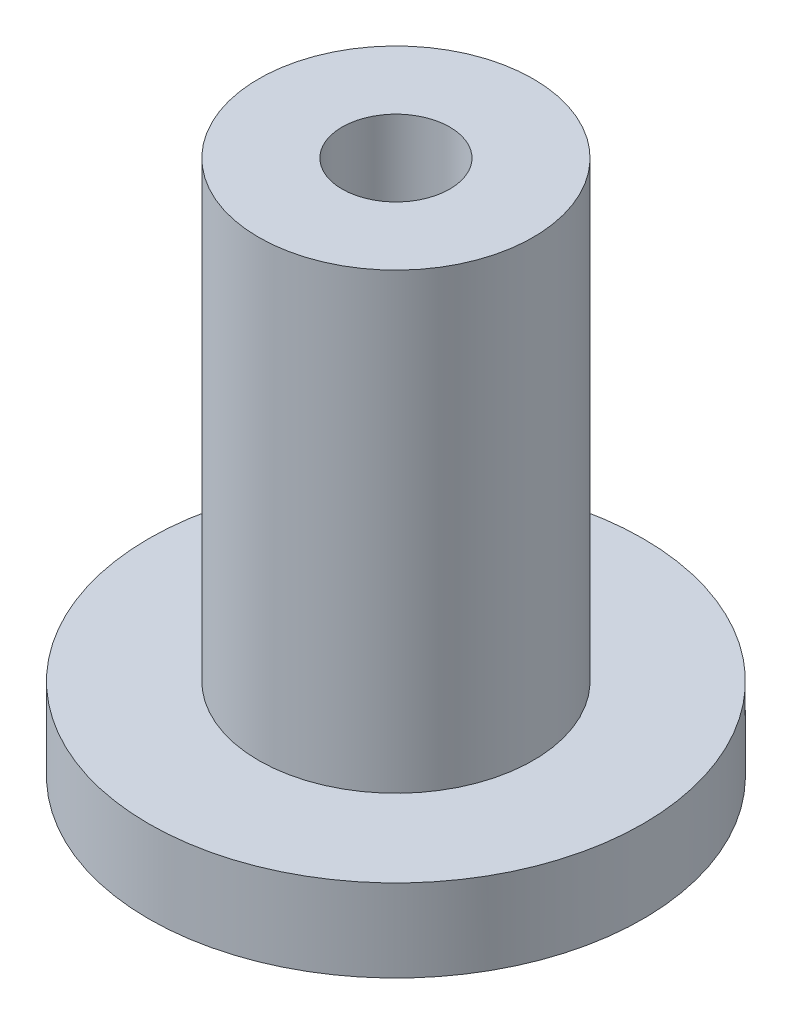
ISO-10303-21;
HEADER;
FILE_DESCRIPTION(('STEP AP214'),'2;1');
FILE_NAME('part.step','',(''),(''),'','','');
FILE_SCHEMA(('AUTOMOTIVE_DESIGN { 1 0 10303 214 1 1 1 1 }'));
ENDSEC;
DATA;
#1=APPLICATION_CONTEXT('core data for automotive mechanical design processes');
#2=APPLICATION_PROTOCOL_DEFINITION('international standard','automotive_design',2000,#1);
#3=PRODUCT_CONTEXT('',#1,'mechanical');
#4=PRODUCT('Part','Part','',(#3));
#5=PRODUCT_RELATED_PRODUCT_CATEGORY('part','',(#4));
#6=PRODUCT_DEFINITION_FORMATION('','',#4);
#7=PRODUCT_DEFINITION_CONTEXT('part definition',#1,'design');
#8=PRODUCT_DEFINITION('design','',#6,#7);
#9=PRODUCT_DEFINITION_SHAPE('','',#8);
#10=(LENGTH_UNIT() NAMED_UNIT(*) SI_UNIT(.MILLI.,.METRE.));
#11=(NAMED_UNIT(*) PLANE_ANGLE_UNIT() SI_UNIT($,.RADIAN.));
#12=(NAMED_UNIT(*) SI_UNIT($,.STERADIAN.) SOLID_ANGLE_UNIT());
#13=UNCERTAINTY_MEASURE_WITH_UNIT(LENGTH_MEASURE(1.E-05),#10,'distance_accuracy_value','');
#14=(GEOMETRIC_REPRESENTATION_CONTEXT(3) GLOBAL_UNCERTAINTY_ASSIGNED_CONTEXT((#13)) GLOBAL_UNIT_ASSIGNED_CONTEXT((#10,
#11,#12)) REPRESENTATION_CONTEXT('',''));
#15=CARTESIAN_POINT('',(0.,0.,0.));
#16=DIRECTION('',(0.,0.,1.));
#17=DIRECTION('',(1.,0.,0.));
#18=AXIS2_PLACEMENT_3D('',#15,#16,#17);
#19=CARTESIAN_POINT('',(0.,26.19375,0.));
#20=DIRECTION('',(0.,-1.,0.));
#21=DIRECTION('',(0.,0.,-1.));
#22=AXIS2_PLACEMENT_3D('',#19,#20,#21);
#23=CYLINDRICAL_SURFACE('',#22,3.1115);
#24=CARTESIAN_POINT('',(0.,26.19375,0.));
#25=DIRECTION('',(0.,1.,0.));
#26=DIRECTION('',(0.,0.,1.));
#27=AXIS2_PLACEMENT_3D('',#24,#25,#26);
#28=CIRCLE('',#27,3.1115);
#29=CARTESIAN_POINT('',(0.,26.19375,3.1115));
#30=VERTEX_POINT('',#29);
#31=EDGE_CURVE('E48',#30,#30,#28,.T.);
#32=ORIENTED_EDGE('',*,*,#31,.T.);
#33=EDGE_LOOP('',(#32));
#34=FACE_BOUND('',#33,.T.);
#35=CARTESIAN_POINT('',(0.,0.126999999999999,0.));
#36=DIRECTION('',(0.,-1.,0.));
#37=DIRECTION('',(0.,0.,-1.));
#38=AXIS2_PLACEMENT_3D('',#35,#36,#37);
#39=CIRCLE('',#38,3.1115);
#40=CARTESIAN_POINT('',(0.,0.126999999999999,-3.1115));
#41=VERTEX_POINT('',#40);
#42=EDGE_CURVE('E34',#41,#41,#39,.T.);
#43=ORIENTED_EDGE('',*,*,#42,.T.);
#44=EDGE_LOOP('',(#43));
#45=FACE_BOUND('',#44,.T.);
#46=ADVANCED_FACE('F30',(#34,#45),#23,.F.);
#47=CARTESIAN_POINT('',(0.,26.19375,0.));
#48=DIRECTION('',(0.,1.,0.));
#49=DIRECTION('',(0.,0.,1.));
#50=AXIS2_PLACEMENT_3D('',#47,#48,#49);
#51=PLANE('',#50);
#52=CARTESIAN_POINT('',(0.,26.19375,0.));
#53=DIRECTION('',(0.,1.,0.));
#54=DIRECTION('',(0.,0.,1.));
#55=AXIS2_PLACEMENT_3D('',#52,#53,#54);
#56=CIRCLE('',#55,7.9375);
#57=CARTESIAN_POINT('',(0.,26.19375,7.9375));
#58=VERTEX_POINT('',#57);
#59=EDGE_CURVE('E42',#58,#58,#56,.T.);
#60=ORIENTED_EDGE('',*,*,#59,.T.);
#61=EDGE_LOOP('',(#60));
#62=FACE_BOUND('',#61,.T.);
#63=ORIENTED_EDGE('',*,*,#31,.F.);
#64=EDGE_LOOP('',(#63));
#65=FACE_BOUND('',#64,.T.);
#66=ADVANCED_FACE('F77',(#62,#65),#51,.T.);
#67=CARTESIAN_POINT('',(0.,26.19375,0.));
#68=DIRECTION('',(0.,-1.,0.));
#69=DIRECTION('',(0.,0.,-1.));
#70=AXIS2_PLACEMENT_3D('',#67,#68,#69);
#71=CYLINDRICAL_SURFACE('',#70,7.9375);
#72=ORIENTED_EDGE('',*,*,#59,.F.);
#73=EDGE_LOOP('',(#72));
#74=FACE_BOUND('',#73,.T.);
#75=CARTESIAN_POINT('',(0.,0.,0.));
#76=DIRECTION('',(0.,1.,0.));
#77=DIRECTION('',(0.,0.,1.));
#78=AXIS2_PLACEMENT_3D('',#75,#76,#77);
#79=CIRCLE('',#78,7.9375);
#80=CARTESIAN_POINT('',(0.,0.,7.9375));
#81=VERTEX_POINT('',#80);
#82=EDGE_CURVE('E45',#81,#81,#79,.T.);
#83=ORIENTED_EDGE('',*,*,#82,.T.);
#84=EDGE_LOOP('',(#83));
#85=FACE_BOUND('',#84,.T.);
#86=ADVANCED_FACE('F83',(#74,#85),#71,.T.);
#87=CARTESIAN_POINT('',(0.,-6.35,0.));
#88=DIRECTION('',(0.,1.,0.));
#89=DIRECTION('',(0.,0.,1.));
#90=AXIS2_PLACEMENT_3D('',#87,#88,#89);
#91=CYLINDRICAL_SURFACE('',#90,14.2875);
#92=CARTESIAN_POINT('',(0.,-4.76249999999999,0.));
#93=DIRECTION('',(0.,-1.,0.));
#94=DIRECTION('',(0.,0.,-1.));
#95=AXIS2_PLACEMENT_3D('',#92,#93,#94);
#96=CIRCLE('',#95,14.2875);
#97=CARTESIAN_POINT('',(0.,-4.76249999999999,14.2875));
#98=VERTEX_POINT('',#97);
#99=EDGE_CURVE('E10',#98,#98,#96,.F.);
#100=ORIENTED_EDGE('',*,*,#99,.T.);
#101=EDGE_LOOP('',(#100));
#102=FACE_BOUND('',#101,.T.);
#103=CARTESIAN_POINT('',(0.,0.,0.));
#104=DIRECTION('',(0.,-1.,0.));
#105=DIRECTION('',(0.,0.,-1.));
#106=AXIS2_PLACEMENT_3D('',#103,#104,#105);
#107=CIRCLE('',#106,14.2875);
#108=CARTESIAN_POINT('',(0.,0.,-14.2875));
#109=VERTEX_POINT('',#108);
#110=EDGE_CURVE('E49',#109,#109,#107,.T.);
#111=ORIENTED_EDGE('',*,*,#110,.T.);
#112=EDGE_LOOP('',(#111));
#113=FACE_BOUND('',#112,.T.);
#114=ADVANCED_FACE('F87',(#102,#113),#91,.T.);
#115=CARTESIAN_POINT('',(0.,-6.35,0.));
#116=DIRECTION('',(0.,-1.,0.));
#117=DIRECTION('',(0.,0.,-1.));
#118=AXIS2_PLACEMENT_3D('',#115,#116,#117);
#119=PLANE('',#118);
#120=CARTESIAN_POINT('',(0.,-6.35,0.));
#121=DIRECTION('',(0.,-1.,0.));
#122=DIRECTION('',(0.,0.,-1.));
#123=AXIS2_PLACEMENT_3D('',#120,#121,#122);
#124=CIRCLE('',#123,4.6736);
#125=CARTESIAN_POINT('',(0.,-6.35,-4.6736));
#126=VERTEX_POINT('',#125);
#127=EDGE_CURVE('E56',#126,#126,#124,.T.);
#128=ORIENTED_EDGE('',*,*,#127,.F.);
#129=EDGE_LOOP('',(#128));
#130=FACE_BOUND('',#129,.T.);
#131=CARTESIAN_POINT('',(0.,-6.35,0.));
#132=DIRECTION('',(0.,-1.,0.));
#133=DIRECTION('',(0.,0.,-1.));
#134=AXIS2_PLACEMENT_3D('',#131,#132,#133);
#135=CIRCLE('',#134,9.92587959661578);
#136=CARTESIAN_POINT('',(0.,-6.35,9.92587959661578));
#137=VERTEX_POINT('',#136);
#138=EDGE_CURVE('E38',#137,#137,#135,.T.);
#139=ORIENTED_EDGE('',*,*,#138,.T.);
#140=EDGE_LOOP('',(#139));
#141=FACE_BOUND('',#140,.T.);
#142=ADVANCED_FACE('F94',(#130,#141),#119,.T.);
#143=CARTESIAN_POINT('',(0.,0.,0.));
#144=DIRECTION('',(0.,-1.,0.));
#145=DIRECTION('',(0.,0.,-1.));
#146=AXIS2_PLACEMENT_3D('',#143,#144,#145);
#147=PLANE('',#146);
#148=ORIENTED_EDGE('',*,*,#82,.F.);
#149=EDGE_LOOP('',(#148));
#150=FACE_BOUND('',#149,.T.);
#151=ORIENTED_EDGE('',*,*,#110,.F.);
#152=EDGE_LOOP('',(#151));
#153=FACE_BOUND('',#152,.T.);
#154=ADVANCED_FACE('F99',(#150,#153),#147,.F.);
#155=CARTESIAN_POINT('',(0.,-6.35,0.));
#156=DIRECTION('',(0.,1.,0.));
#157=DIRECTION('',(0.,0.,1.));
#158=AXIS2_PLACEMENT_3D('',#155,#156,#157);
#159=CONICAL_SURFACE('',#158,9.92587959661578,1.22173047639603);
#160=CARTESIAN_POINT('',(0.,-4.76249999999999,14.2875));
#161=CARTESIAN_POINT('',(0.,-4.77903645833332,14.2420664541314));
#162=CARTESIAN_POINT('',(0.,-4.79557291666666,14.1966329082628));
#163=CARTESIAN_POINT('',(0.,-4.82864583333332,14.1057658165257));
#164=CARTESIAN_POINT('',(0.,-4.84518229166666,14.0603322706571));
#165=CARTESIAN_POINT('',(0.,-4.87825520833333,13.9694651789199));
#166=CARTESIAN_POINT('',(0.,-4.89479166666666,13.9240316330513));
#167=CARTESIAN_POINT('',(0.,-4.92786458333333,13.8331645413141));
#168=CARTESIAN_POINT('',(0.,-4.94440104166666,13.7877309954456));
#169=CARTESIAN_POINT('',(0.,-4.97747395833333,13.6968639037084));
#170=CARTESIAN_POINT('',(0.,-4.99401041666666,13.6514303578398));
#171=CARTESIAN_POINT('',(0.,-5.02708333333333,13.5605632661026));
#172=CARTESIAN_POINT('',(0.,-5.04361979166666,13.515129720234));
#173=CARTESIAN_POINT('',(0.,-5.07669270833333,13.4242626284969));
#174=CARTESIAN_POINT('',(0.,-5.09322916666666,13.3788290826283));
#175=CARTESIAN_POINT('',(0.,-5.12630208333333,13.2879619908911));
#176=CARTESIAN_POINT('',(0.,-5.14283854166666,13.2425284450225));
#177=CARTESIAN_POINT('',(0.,-5.17591145833333,13.1516613532854));
#178=CARTESIAN_POINT('',(0.,-5.19244791666666,13.1062278074168));
#179=CARTESIAN_POINT('',(0.,-5.22552083333333,13.0153607156796));
#180=CARTESIAN_POINT('',(0.,-5.24205729166666,12.969927169811));
#181=CARTESIAN_POINT('',(0.,-5.27513020833333,12.8790600780738));
#182=CARTESIAN_POINT('',(0.,-5.29166666666666,12.8336265322053));
#183=CARTESIAN_POINT('',(0.,-5.32473958333333,12.7427594404681));
#184=CARTESIAN_POINT('',(0.,-5.34127604166666,12.6973258945995));
#185=CARTESIAN_POINT('',(0.,-5.37434895833333,12.6064588028623));
#186=CARTESIAN_POINT('',(0.,-5.39088541666666,12.5610252569937));
#187=CARTESIAN_POINT('',(0.,-5.42395833333333,12.4701581652566));
#188=CARTESIAN_POINT('',(0.,-5.44049479166666,12.424724619388));
#189=CARTESIAN_POINT('',(0.,-5.47356770833333,12.3338575276508));
#190=CARTESIAN_POINT('',(0.,-5.49010416666666,12.2884239817822));
#191=CARTESIAN_POINT('',(0.,-5.52317708333333,12.1975568900451));
#192=CARTESIAN_POINT('',(0.,-5.53971354166666,12.1521233441765));
#193=CARTESIAN_POINT('',(0.,-5.57278645833333,12.0612562524393));
#194=CARTESIAN_POINT('',(0.,-5.58932291666666,12.0158227065707));
#195=CARTESIAN_POINT('',(0.,-5.62239583333333,11.9249556148335));
#196=CARTESIAN_POINT('',(0.,-5.63893229166666,11.879522068965));
#197=CARTESIAN_POINT('',(0.,-5.67200520833333,11.7886549772278));
#198=CARTESIAN_POINT('',(0.,-5.68854166666666,11.7432214313592));
#199=CARTESIAN_POINT('',(0.,-5.72161458333333,11.652354339622));
#200=CARTESIAN_POINT('',(0.,-5.73815104166666,11.6069207937534));
#201=CARTESIAN_POINT('',(0.,-5.77122395833333,11.5160537020163));
#202=CARTESIAN_POINT('',(0.,-5.78776041666666,11.4706201561477));
#203=CARTESIAN_POINT('',(0.,-5.82083333333333,11.3797530644105));
#204=CARTESIAN_POINT('',(0.,-5.83736979166666,11.3343195185419));
#205=CARTESIAN_POINT('',(0.,-5.87044270833333,11.2434524268048));
#206=CARTESIAN_POINT('',(0.,-5.88697916666666,11.1980188809362));
#207=CARTESIAN_POINT('',(0.,-5.92005208333333,11.107151789199));
#208=CARTESIAN_POINT('',(0.,-5.93658854166666,11.0617182433304));
#209=CARTESIAN_POINT('',(0.,-5.96966145833333,10.9708511515932));
#210=CARTESIAN_POINT('',(0.,-5.98619791666666,10.9254176057247));
#211=CARTESIAN_POINT('',(0.,-6.01927083333333,10.8345505139875));
#212=CARTESIAN_POINT('',(0.,-6.03580729166666,10.7891169681189));
#213=CARTESIAN_POINT('',(0.,-6.06888020833333,10.6982498763817));
#214=CARTESIAN_POINT('',(0.,-6.08541666666667,10.6528163305131));
#215=CARTESIAN_POINT('',(0.,-6.11848958333333,10.561949238776));
#216=CARTESIAN_POINT('',(0.,-6.13502604166666,10.5165156929074));
#217=CARTESIAN_POINT('',(0.,-6.16809895833333,10.4256486011702));
#218=CARTESIAN_POINT('',(0.,-6.18463541666667,10.3802150553016));
#219=CARTESIAN_POINT('',(0.,-6.21770833333333,10.2893479635645));
#220=CARTESIAN_POINT('',(0.,-6.23424479166667,10.2439144176959));
#221=CARTESIAN_POINT('',(0.,-6.26731770833333,10.1530473259587));
#222=CARTESIAN_POINT('',(0.,-6.28385416666667,10.1076137800901));
#223=CARTESIAN_POINT('',(0.,-6.31692708333333,10.0167466883529));
#224=CARTESIAN_POINT('',(0.,-6.33346354166667,9.97131314248436));
#225=CARTESIAN_POINT('',(0.,-6.35,9.92587959661578));
#226=B_SPLINE_CURVE_WITH_KNOTS('',3,(#160,#161,#162,#163,#164,#165,#166,#167,#168,#169,#170,
#171,#172,#173,#174,#175,#176,#177,#178,#179,#180,#181,#182,#183,#184,#185,#186,#187,#188,#189,
#190,#191,#192,#193,#194,#195,#196,#197,#198,#199,#200,#201,#202,#203,#204,#205,#206,#207,#208,
#209,#210,#211,#212,#213,#214,#215,#216,#217,#218,#219,#220,#221,#222,#223,#224,#225),
.UNSPECIFIED.,.F.,.F.,(4,2,2,2,2,2,2,2,2,2,2,2,2,2,2,2,2,2,2,2,2,2,2,2,2,2,2,2,2,2,2,2,4),(0.,
0.145048108914339,0.290096217828682,0.435144326743023,0.580192435657364,0.725240544571706,
0.870288653486047,1.01533676240039,1.16038487131473,1.30543298022907,1.45048108914341,
1.59552919805775,1.74057730697209,1.88562541588644,2.03067352480078,2.17572163371512,
2.32076974262946,2.4658178515438,2.61086596045814,2.75591406937248,2.90096217828682,
3.04601028720117,3.19105839611551,3.33610650502985,3.48115461394419,3.62620272285853,
3.77125083177287,3.91629894068721,4.06134704960155,4.2063951585159,4.35144326743024,
4.49649137634458,4.64153948525892),.UNSPECIFIED.);
#227=EDGE_CURVE('BSEAM32',#98,#137,#226,.T.);
#228=ORIENTED_EDGE('',*,*,#99,.F.);
#229=ORIENTED_EDGE('',*,*,#138,.F.);
#230=ORIENTED_EDGE('',*,*,#227,.T.);
#231=ORIENTED_EDGE('',*,*,#227,.F.);
#232=EDGE_LOOP('',(#228,#230,#229,#231));
#233=FACE_BOUND('',#232,.T.);
#234=ADVANCED_FACE('F32',(#233),#159,.T.);
#235=CARTESIAN_POINT('',(0.,0.127,0.));
#236=DIRECTION('',(0.,-1.,0.));
#237=DIRECTION('',(0.,0.,-1.));
#238=AXIS2_PLACEMENT_3D('',#235,#236,#237);
#239=CYLINDRICAL_SURFACE('',#238,4.6736);
#240=CARTESIAN_POINT('',(0.,0.127,0.));
#241=DIRECTION('',(0.,-1.,0.));
#242=DIRECTION('',(0.,0.,-1.));
#243=AXIS2_PLACEMENT_3D('',#240,#241,#242);
#244=CIRCLE('',#243,4.6736);
#245=CARTESIAN_POINT('',(0.,0.127,-4.6736));
#246=VERTEX_POINT('',#245);
#247=EDGE_CURVE('E59',#246,#246,#244,.T.);
#248=ORIENTED_EDGE('',*,*,#247,.F.);
#249=EDGE_LOOP('',(#248));
#250=FACE_BOUND('',#249,.T.);
#251=ORIENTED_EDGE('',*,*,#127,.T.);
#252=EDGE_LOOP('',(#251));
#253=FACE_BOUND('',#252,.T.);
#254=ADVANCED_FACE('F69',(#250,#253),#239,.F.);
#255=CARTESIAN_POINT('',(0.,0.127,0.));
#256=DIRECTION('',(0.,-1.,0.));
#257=DIRECTION('',(0.,0.,-1.));
#258=AXIS2_PLACEMENT_3D('',#255,#256,#257);
#259=PLANE('',#258);
#260=ORIENTED_EDGE('',*,*,#42,.F.);
#261=EDGE_LOOP('',(#260));
#262=FACE_BOUND('',#261,.T.);
#263=ORIENTED_EDGE('',*,*,#247,.T.);
#264=EDGE_LOOP('',(#263));
#265=FACE_BOUND('',#264,.T.);
#266=ADVANCED_FACE('F67',(#262,#265),#259,.T.);
#267=CLOSED_SHELL('',(#46,#66,#86,#114,#142,#154,#234,#254,#266));
#268=MANIFOLD_SOLID_BREP('B2',#267);
#269=ADVANCED_BREP_SHAPE_REPRESENTATION('',(#18,#268),#14);
#270=SHAPE_DEFINITION_REPRESENTATION(#9,#269);
ENDSEC;
END-ISO-10303-21;
